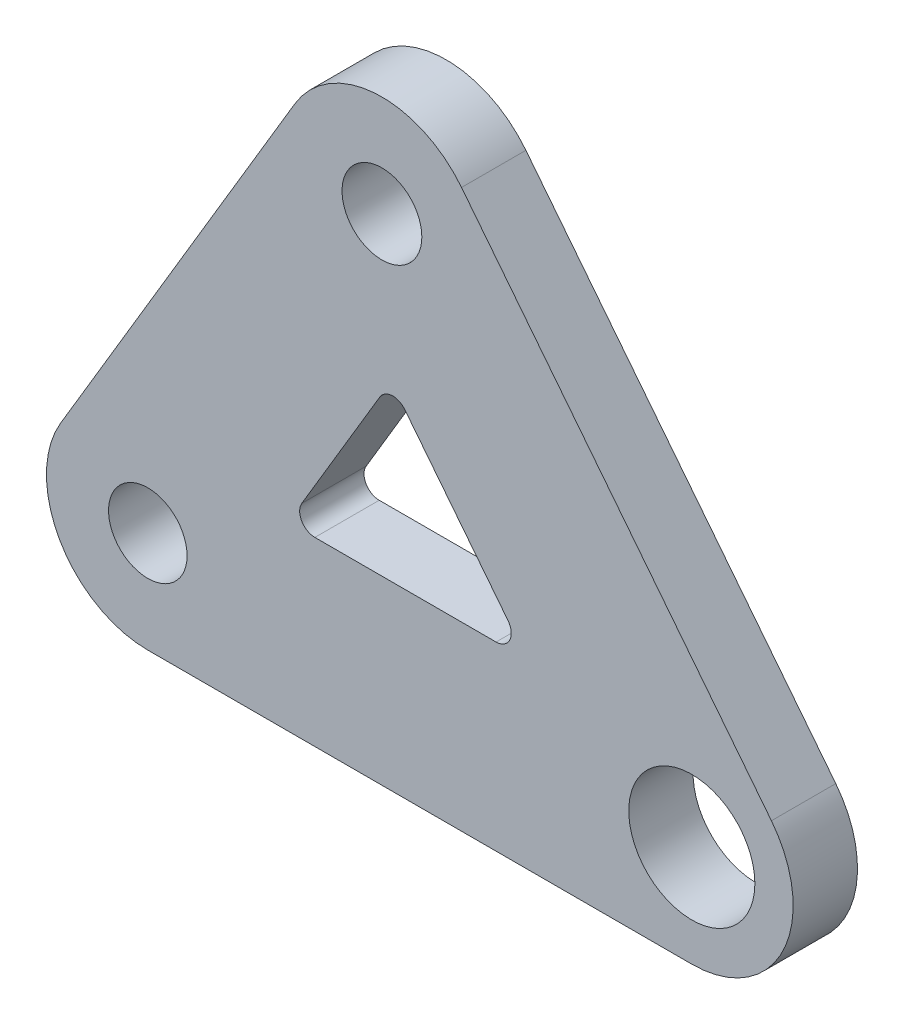
ISO-10303-21;
HEADER;
FILE_DESCRIPTION(('STEP AP214'),'2;1');
FILE_NAME('part.step','',(''),(''),'','','');
FILE_SCHEMA(('AUTOMOTIVE_DESIGN { 1 0 10303 214 1 1 1 1 }'));
ENDSEC;
DATA;
#1=APPLICATION_CONTEXT('core data for automotive mechanical design processes');
#2=APPLICATION_PROTOCOL_DEFINITION('international standard','automotive_design',2000,#1);
#3=PRODUCT_CONTEXT('',#1,'mechanical');
#4=PRODUCT('Part','Part','',(#3));
#5=PRODUCT_RELATED_PRODUCT_CATEGORY('part','',(#4));
#6=PRODUCT_DEFINITION_FORMATION('','',#4);
#7=PRODUCT_DEFINITION_CONTEXT('part definition',#1,'design');
#8=PRODUCT_DEFINITION('design','',#6,#7);
#9=PRODUCT_DEFINITION_SHAPE('','',#8);
#10=(LENGTH_UNIT() NAMED_UNIT(*) SI_UNIT(.MILLI.,.METRE.));
#11=(NAMED_UNIT(*) PLANE_ANGLE_UNIT() SI_UNIT($,.RADIAN.));
#12=(NAMED_UNIT(*) SI_UNIT($,.STERADIAN.) SOLID_ANGLE_UNIT());
#13=UNCERTAINTY_MEASURE_WITH_UNIT(LENGTH_MEASURE(1.E-05),#10,'distance_accuracy_value','');
#14=(GEOMETRIC_REPRESENTATION_CONTEXT(3) GLOBAL_UNCERTAINTY_ASSIGNED_CONTEXT((#13)) GLOBAL_UNIT_ASSIGNED_CONTEXT((#10,
#11,#12)) REPRESENTATION_CONTEXT('',''));
#15=CARTESIAN_POINT('',(0.,0.,0.));
#16=DIRECTION('',(0.,0.,1.));
#17=DIRECTION('',(1.,0.,0.));
#18=AXIS2_PLACEMENT_3D('',#15,#16,#17);
#19=CARTESIAN_POINT('',(-6.18682031703361,-4.8722560857102,6.35));
#20=DIRECTION('',(-0.785627976766173,-0.618699185487009,0.));
#21=DIRECTION('',(0.61869918548701,-0.785627976766173,0.));
#22=AXIS2_PLACEMENT_3D('',#19,#20,#21);
#23=PLANE('',#22);
#24=DIRECTION('',(-0.61869918548701,0.785627976766173,0.));
#25=VECTOR('',#24,1.);
#26=CARTESIAN_POINT('',(-6.18682031703361,-4.8722560857102,6.35));
#27=LINE('',#26,#25);
#28=CARTESIAN_POINT('',(12.4422084163789,-28.5275097150316,6.35));
#29=VERTEX_POINT('',#28);
#30=CARTESIAN_POINT('',(2.25684342657164,-15.5940714993847,6.35));
#31=VERTEX_POINT('',#30);
#32=EDGE_CURVE('E195',#29,#31,#27,.T.);
#33=ORIENTED_EDGE('',*,*,#32,.T.);
#34=DIRECTION('',(0.,0.,-1.));
#35=VECTOR('',#34,1.);
#36=CARTESIAN_POINT('',(2.25684342657164,-15.5940714993847,0.));
#37=LINE('',#36,#35);
#38=CARTESIAN_POINT('',(2.25684342657164,-15.5940714993847,0.));
#39=VERTEX_POINT('',#38);
#40=EDGE_CURVE('E271',#31,#39,#37,.T.);
#41=ORIENTED_EDGE('',*,*,#40,.T.);
#42=DIRECTION('',(-0.61869918548701,0.785627976766173,0.));
#43=VECTOR('',#42,1.);
#44=CARTESIAN_POINT('',(-6.18682031703361,-4.8722560857102,0.));
#45=LINE('',#44,#43);
#46=CARTESIAN_POINT('',(12.4422084163789,-28.5275097150316,0.));
#47=VERTEX_POINT('',#46);
#48=EDGE_CURVE('E238',#47,#39,#45,.T.);
#49=ORIENTED_EDGE('',*,*,#48,.F.);
#50=DIRECTION('',(0.,0.,-1.));
#51=VECTOR('',#50,1.);
#52=CARTESIAN_POINT('',(12.4422084163789,-28.5275097150316,6.35));
#53=LINE('',#52,#51);
#54=EDGE_CURVE('E158',#47,#29,#53,.F.);
#55=ORIENTED_EDGE('',*,*,#54,.T.);
#56=EDGE_LOOP('',(#33,#41,#49,#55));
#57=FACE_BOUND('',#56,.T.);
#58=ADVANCED_FACE('F54',(#57),#23,.T.);
#59=CARTESIAN_POINT('',(0.,-30.9555584932621,6.35));
#60=DIRECTION('',(0.,1.,0.));
#61=DIRECTION('',(0.,0.,1.));
#62=AXIS2_PLACEMENT_3D('',#59,#60,#61);
#63=PLANE('',#62);
#64=DIRECTION('',(1.,0.,0.));
#65=VECTOR('',#64,1.);
#66=CARTESIAN_POINT('',(0.,-30.9555584932621,6.35));
#67=LINE('',#66,#65);
#68=CARTESIAN_POINT('',(-6.61691580397189,-30.9555584932621,6.35));
#69=VERTEX_POINT('',#68);
#70=CARTESIAN_POINT('',(11.2637664512296,-30.9555584932621,6.35));
#71=VERTEX_POINT('',#70);
#72=EDGE_CURVE('E200',#69,#71,#67,.T.);
#73=ORIENTED_EDGE('',*,*,#72,.T.);
#74=DIRECTION('',(0.,0.,-1.));
#75=VECTOR('',#74,1.);
#76=CARTESIAN_POINT('',(11.2637664512296,-30.9555584932621,0.));
#77=LINE('',#76,#75);
#78=CARTESIAN_POINT('',(11.2637664512296,-30.9555584932621,0.));
#79=VERTEX_POINT('',#78);
#80=EDGE_CURVE('E288',#71,#79,#77,.T.);
#81=ORIENTED_EDGE('',*,*,#80,.T.);
#82=DIRECTION('',(1.,0.,0.));
#83=VECTOR('',#82,1.);
#84=CARTESIAN_POINT('',(0.,-30.9555584932621,0.));
#85=LINE('',#84,#83);
#86=CARTESIAN_POINT('',(-6.61691580397189,-30.9555584932621,0.));
#87=VERTEX_POINT('',#86);
#88=EDGE_CURVE('E245',#87,#79,#85,.T.);
#89=ORIENTED_EDGE('',*,*,#88,.F.);
#90=DIRECTION('',(0.,0.,-1.));
#91=VECTOR('',#90,1.);
#92=CARTESIAN_POINT('',(-6.61691580397189,-30.9555584932621,6.35));
#93=LINE('',#92,#91);
#94=EDGE_CURVE('E76',#87,#69,#93,.F.);
#95=ORIENTED_EDGE('',*,*,#94,.T.);
#96=EDGE_LOOP('',(#73,#81,#89,#95));
#97=FACE_BOUND('',#96,.T.);
#98=ADVANCED_FACE('F307',(#97),#63,.T.);
#99=CARTESIAN_POINT('',(-8.59385093655867,5.11328916454076,6.35));
#100=DIRECTION('',(-0.859385093655866,0.511328916454075,0.));
#101=DIRECTION('',(-0.511328916454075,-0.859385093655866,0.));
#102=AXIS2_PLACEMENT_3D('',#99,#100,#101);
#103=PLANE('',#102);
#104=DIRECTION('',(0.511328916454075,0.859385093655866,0.));
#105=VECTOR('',#104,1.);
#106=CARTESIAN_POINT('',(-8.59385093655867,5.11328916454076,0.));
#107=LINE('',#106,#105);
#108=CARTESIAN_POINT('',(-31.6977976377999,-33.7172693287214,0.));
#109=VERTEX_POINT('',#108);
#110=CARTESIAN_POINT('',(-8.59385093655866,5.11328916454076,0.));
#111=VERTEX_POINT('',#110);
#112=EDGE_CURVE('E154',#109,#111,#107,.T.);
#113=ORIENTED_EDGE('',*,*,#112,.F.);
#114=DIRECTION('',(0.,0.,-1.));
#115=VECTOR('',#114,1.);
#116=CARTESIAN_POINT('',(-31.6977976377999,-33.7172693287214,6.35));
#117=LINE('',#116,#115);
#118=CARTESIAN_POINT('',(-31.6977976377999,-33.7172693287214,6.35));
#119=VERTEX_POINT('',#118);
#120=EDGE_CURVE('E148',#119,#109,#117,.T.);
#121=ORIENTED_EDGE('',*,*,#120,.F.);
#122=DIRECTION('',(0.511328916454075,0.859385093655866,0.));
#123=VECTOR('',#122,1.);
#124=CARTESIAN_POINT('',(-8.59385093655867,5.11328916454076,6.35));
#125=LINE('',#124,#123);
#126=CARTESIAN_POINT('',(-8.59385093655866,5.11328916454076,6.35));
#127=VERTEX_POINT('',#126);
#128=EDGE_CURVE('E146',#119,#127,#125,.T.);
#129=ORIENTED_EDGE('',*,*,#128,.T.);
#130=DIRECTION('',(0.,0.,-1.));
#131=VECTOR('',#130,1.);
#132=CARTESIAN_POINT('',(-8.59385093655866,5.11328916454076,6.35));
#133=LINE('',#132,#131);
#134=EDGE_CURVE('E219',#127,#111,#133,.T.);
#135=ORIENTED_EDGE('',*,*,#134,.T.);
#136=EDGE_LOOP('',(#113,#121,#129,#135));
#137=FACE_BOUND('',#136,.T.);
#138=ADVANCED_FACE('F147',(#137),#103,.T.);
#139=CARTESIAN_POINT('',(-23.1039467012412,-38.8305584932621,6.35));
#140=DIRECTION('',(0.,0.,-1.));
#141=DIRECTION('',(-1.,0.,0.));
#142=AXIS2_PLACEMENT_3D('',#139,#140,#141);
#143=CYLINDRICAL_SURFACE('',#142,10.);
#144=CARTESIAN_POINT('',(-23.1039467012412,-38.8305584932621,0.));
#145=DIRECTION('',(0.,0.,1.));
#146=DIRECTION('',(1.,0.,0.));
#147=AXIS2_PLACEMENT_3D('',#144,#145,#146);
#148=CIRCLE('',#147,10.);
#149=CARTESIAN_POINT('',(-23.1039467012412,-48.8305584932621,0.));
#150=VERTEX_POINT('',#149);
#151=EDGE_CURVE('E218',#109,#150,#148,.T.);
#152=ORIENTED_EDGE('',*,*,#151,.T.);
#153=DIRECTION('',(0.,0.,-1.));
#154=VECTOR('',#153,1.);
#155=CARTESIAN_POINT('',(-23.1039467012412,-48.8305584932621,6.35));
#156=LINE('',#155,#154);
#157=CARTESIAN_POINT('',(-23.1039467012412,-48.8305584932621,6.35));
#158=VERTEX_POINT('',#157);
#159=EDGE_CURVE('E159',#158,#150,#156,.T.);
#160=ORIENTED_EDGE('',*,*,#159,.F.);
#161=CARTESIAN_POINT('',(-23.1039467012412,-38.8305584932621,6.35));
#162=DIRECTION('',(0.,0.,1.));
#163=DIRECTION('',(1.,0.,0.));
#164=AXIS2_PLACEMENT_3D('',#161,#162,#163);
#165=CIRCLE('',#164,10.);
#166=EDGE_CURVE('E156',#119,#158,#165,.T.);
#167=ORIENTED_EDGE('',*,*,#166,.F.);
#168=ORIENTED_EDGE('',*,*,#120,.T.);
#169=EDGE_LOOP('',(#152,#160,#167,#168));
#170=FACE_BOUND('',#169,.T.);
#171=ADVANCED_FACE('F163',(#170),#143,.T.);
#172=CARTESIAN_POINT('',(0.,-48.8305584932621,6.35));
#173=DIRECTION('',(0.,1.,0.));
#174=DIRECTION('',(0.,0.,1.));
#175=AXIS2_PLACEMENT_3D('',#172,#173,#174);
#176=PLANE('',#175);
#177=DIRECTION('',(1.,0.,0.));
#178=VECTOR('',#177,1.);
#179=CARTESIAN_POINT('',(0.,-48.8305584932621,0.));
#180=LINE('',#179,#178);
#181=CARTESIAN_POINT('',(30.5799126587588,-48.8305584932621,0.));
#182=VERTEX_POINT('',#181);
#183=EDGE_CURVE('E222',#150,#182,#180,.T.);
#184=ORIENTED_EDGE('',*,*,#183,.T.);
#185=DIRECTION('',(0.,0.,-1.));
#186=VECTOR('',#185,1.);
#187=CARTESIAN_POINT('',(30.5799126587588,-48.8305584932621,6.35));
#188=LINE('',#187,#186);
#189=CARTESIAN_POINT('',(30.5799126587588,-48.8305584932621,6.35));
#190=VERTEX_POINT('',#189);
#191=EDGE_CURVE('E263',#190,#182,#188,.T.);
#192=ORIENTED_EDGE('',*,*,#191,.F.);
#193=DIRECTION('',(1.,0.,0.));
#194=VECTOR('',#193,1.);
#195=CARTESIAN_POINT('',(0.,-48.8305584932621,6.35));
#196=LINE('',#195,#194);
#197=EDGE_CURVE('E168',#158,#190,#196,.T.);
#198=ORIENTED_EDGE('',*,*,#197,.F.);
#199=ORIENTED_EDGE('',*,*,#159,.T.);
#200=EDGE_LOOP('',(#184,#192,#198,#199));
#201=FACE_BOUND('',#200,.T.);
#202=ADVANCED_FACE('F355',(#201),#176,.F.);
#203=CARTESIAN_POINT('',(30.5799126587588,-38.8305584932621,6.35));
#204=DIRECTION('',(0.,0.,-1.));
#205=DIRECTION('',(-1.,0.,0.));
#206=AXIS2_PLACEMENT_3D('',#203,#204,#205);
#207=CYLINDRICAL_SURFACE('',#206,10.);
#208=CARTESIAN_POINT('',(30.5799126587588,-38.8305584932621,0.));
#209=DIRECTION('',(0.,0.,1.));
#210=DIRECTION('',(1.,0.,0.));
#211=AXIS2_PLACEMENT_3D('',#208,#209,#210);
#212=CIRCLE('',#211,10.);
#213=CARTESIAN_POINT('',(38.4361924264205,-32.643566638392,0.));
#214=VERTEX_POINT('',#213);
#215=EDGE_CURVE('E228',#182,#214,#212,.T.);
#216=ORIENTED_EDGE('',*,*,#215,.T.);
#217=DIRECTION('',(0.,0.,-1.));
#218=VECTOR('',#217,1.);
#219=CARTESIAN_POINT('',(38.4361924264205,-32.643566638392,6.35));
#220=LINE('',#219,#218);
#221=CARTESIAN_POINT('',(38.4361924264205,-32.643566638392,6.35));
#222=VERTEX_POINT('',#221);
#223=EDGE_CURVE('E264',#222,#214,#220,.T.);
#224=ORIENTED_EDGE('',*,*,#223,.F.);
#225=CARTESIAN_POINT('',(30.5799126587588,-38.8305584932621,6.35));
#226=DIRECTION('',(0.,0.,1.));
#227=DIRECTION('',(1.,0.,0.));
#228=AXIS2_PLACEMENT_3D('',#225,#226,#227);
#229=CIRCLE('',#228,10.);
#230=EDGE_CURVE('E184',#190,#222,#229,.T.);
#231=ORIENTED_EDGE('',*,*,#230,.F.);
#232=ORIENTED_EDGE('',*,*,#191,.T.);
#233=EDGE_LOOP('',(#216,#224,#231,#232));
#234=FACE_BOUND('',#233,.T.);
#235=ADVANCED_FACE('F348',(#234),#207,.T.);
#236=CARTESIAN_POINT('',(7.85627976766173,6.1869918548701,6.35));
#237=DIRECTION('',(0.785627976766173,0.61869918548701,0.));
#238=DIRECTION('',(-0.61869918548701,0.785627976766173,0.));
#239=AXIS2_PLACEMENT_3D('',#236,#237,#238);
#240=PLANE('',#239);
#241=DIRECTION('',(0.61869918548701,-0.785627976766173,0.));
#242=VECTOR('',#241,1.);
#243=CARTESIAN_POINT('',(7.85627976766173,6.1869918548701,0.));
#244=LINE('',#243,#242);
#245=CARTESIAN_POINT('',(7.85627976766173,6.1869918548701,0.));
#246=VERTEX_POINT('',#245);
#247=EDGE_CURVE('E229',#246,#214,#244,.T.);
#248=ORIENTED_EDGE('',*,*,#247,.F.);
#249=DIRECTION('',(0.,0.,-1.));
#250=VECTOR('',#249,1.);
#251=CARTESIAN_POINT('',(7.85627976766173,6.1869918548701,6.35));
#252=LINE('',#251,#250);
#253=CARTESIAN_POINT('',(7.85627976766173,6.1869918548701,6.35));
#254=VERTEX_POINT('',#253);
#255=EDGE_CURVE('E260',#254,#246,#252,.T.);
#256=ORIENTED_EDGE('',*,*,#255,.F.);
#257=DIRECTION('',(0.61869918548701,-0.785627976766173,0.));
#258=VECTOR('',#257,1.);
#259=CARTESIAN_POINT('',(7.85627976766173,6.1869918548701,6.35));
#260=LINE('',#259,#258);
#261=EDGE_CURVE('E189',#254,#222,#260,.T.);
#262=ORIENTED_EDGE('',*,*,#261,.T.);
#263=ORIENTED_EDGE('',*,*,#223,.T.);
#264=EDGE_LOOP('',(#248,#256,#262,#263));
#265=FACE_BOUND('',#264,.T.);
#266=ADVANCED_FACE('F347',(#265),#240,.T.);
#267=CARTESIAN_POINT('',(30.5799126587588,-38.8305584932621,6.35));
#268=DIRECTION('',(0.,0.,-1.));
#269=DIRECTION('',(-1.,0.,0.));
#270=AXIS2_PLACEMENT_3D('',#267,#268,#269);
#271=CYLINDRICAL_SURFACE('',#270,6.223);
#272=CARTESIAN_POINT('',(30.5799126587588,-38.8305584932621,6.35));
#273=DIRECTION('',(0.,0.,1.));
#274=DIRECTION('',(1.,0.,0.));
#275=AXIS2_PLACEMENT_3D('',#272,#273,#274);
#276=CIRCLE('',#275,6.223);
#277=CARTESIAN_POINT('',(36.8029126587588,-38.8305584932621,6.35));
#278=VERTEX_POINT('',#277);
#279=EDGE_CURVE('E209',#278,#278,#276,.T.);
#280=ORIENTED_EDGE('',*,*,#279,.T.);
#281=EDGE_LOOP('',(#280));
#282=FACE_BOUND('',#281,.T.);
#283=CARTESIAN_POINT('',(30.5799126587588,-38.8305584932621,0.));
#284=DIRECTION('',(0.,0.,1.));
#285=DIRECTION('',(1.,0.,0.));
#286=AXIS2_PLACEMENT_3D('',#283,#284,#285);
#287=CIRCLE('',#286,6.223);
#288=CARTESIAN_POINT('',(36.8029126587588,-38.8305584932621,0.));
#289=VERTEX_POINT('',#288);
#290=EDGE_CURVE('E179',#289,#289,#287,.T.);
#291=ORIENTED_EDGE('',*,*,#290,.F.);
#292=EDGE_LOOP('',(#291));
#293=FACE_BOUND('',#292,.T.);
#294=ADVANCED_FACE('F346',(#282,#293),#271,.F.);
#295=CARTESIAN_POINT('',(0.,0.,6.35));
#296=DIRECTION('',(0.,0.,-1.));
#297=DIRECTION('',(-1.,0.,0.));
#298=AXIS2_PLACEMENT_3D('',#295,#296,#297);
#299=CYLINDRICAL_SURFACE('',#298,3.9375);
#300=CARTESIAN_POINT('',(0.,0.,6.35));
#301=DIRECTION('',(0.,0.,1.));
#302=DIRECTION('',(1.,0.,0.));
#303=AXIS2_PLACEMENT_3D('',#300,#301,#302);
#304=CIRCLE('',#303,3.9375);
#305=CARTESIAN_POINT('',(3.9375,0.,6.35));
#306=VERTEX_POINT('',#305);
#307=EDGE_CURVE('E201',#306,#306,#304,.T.);
#308=ORIENTED_EDGE('',*,*,#307,.T.);
#309=EDGE_LOOP('',(#308));
#310=FACE_BOUND('',#309,.T.);
#311=CARTESIAN_POINT('',(0.,0.,0.));
#312=DIRECTION('',(0.,0.,1.));
#313=DIRECTION('',(1.,0.,0.));
#314=AXIS2_PLACEMENT_3D('',#311,#312,#313);
#315=CIRCLE('',#314,3.9375);
#316=CARTESIAN_POINT('',(3.9375,0.,0.));
#317=VERTEX_POINT('',#316);
#318=EDGE_CURVE('E249',#317,#317,#315,.T.);
#319=ORIENTED_EDGE('',*,*,#318,.F.);
#320=EDGE_LOOP('',(#319));
#321=FACE_BOUND('',#320,.T.);
#322=ADVANCED_FACE('F390',(#310,#321),#299,.F.);
#323=CARTESIAN_POINT('',(6.76765761253994,-4.02671521707585,6.35));
#324=DIRECTION('',(0.859385093655866,-0.511328916454076,0.));
#325=DIRECTION('',(0.511328916454076,0.859385093655866,0.));
#326=AXIS2_PLACEMENT_3D('',#323,#324,#325);
#327=PLANE('',#326);
#328=DIRECTION('',(-0.511328916454076,-0.859385093655866,0.));
#329=VECTOR('',#328,1.);
#330=CARTESIAN_POINT('',(6.76765761253994,-4.02671521707585,0.));
#331=LINE('',#330,#329);
#332=CARTESIAN_POINT('',(-0.21067617906142,-15.7551269029341,0.));
#333=VERTEX_POINT('',#332);
#334=CARTESIAN_POINT('',(-7.9059934444557,-28.688565118581,0.));
#335=VERTEX_POINT('',#334);
#336=EDGE_CURVE('E246',#333,#335,#331,.T.);
#337=ORIENTED_EDGE('',*,*,#336,.F.);
#338=DIRECTION('',(0.,0.,-1.));
#339=VECTOR('',#338,1.);
#340=CARTESIAN_POINT('',(-0.210676179061417,-15.7551269029341,6.35));
#341=LINE('',#340,#339);
#342=CARTESIAN_POINT('',(-0.21067617906142,-15.7551269029341,6.35));
#343=VERTEX_POINT('',#342);
#344=EDGE_CURVE('E282',#333,#343,#341,.F.);
#345=ORIENTED_EDGE('',*,*,#344,.T.);
#346=DIRECTION('',(-0.511328916454076,-0.859385093655866,0.));
#347=VECTOR('',#346,1.);
#348=CARTESIAN_POINT('',(6.76765761253994,-4.02671521707585,6.35));
#349=LINE('',#348,#347);
#350=CARTESIAN_POINT('',(-7.9059934444557,-28.688565118581,6.35));
#351=VERTEX_POINT('',#350);
#352=EDGE_CURVE('E203',#343,#351,#349,.T.);
#353=ORIENTED_EDGE('',*,*,#352,.T.);
#354=DIRECTION('',(0.,0.,-1.));
#355=VECTOR('',#354,1.);
#356=CARTESIAN_POINT('',(-7.90599344445569,-28.688565118581,0.));
#357=LINE('',#356,#355);
#358=EDGE_CURVE('E279',#351,#335,#357,.T.);
#359=ORIENTED_EDGE('',*,*,#358,.T.);
#360=EDGE_LOOP('',(#337,#345,#353,#359));
#361=FACE_BOUND('',#360,.T.);
#362=ADVANCED_FACE('F317',(#361),#327,.T.);
#363=CARTESIAN_POINT('',(0.,0.,6.35));
#364=DIRECTION('',(0.,0.,-1.));
#365=DIRECTION('',(-1.,0.,0.));
#366=AXIS2_PLACEMENT_3D('',#363,#364,#365);
#367=CYLINDRICAL_SURFACE('',#366,10.);
#368=CARTESIAN_POINT('',(0.,0.,0.));
#369=DIRECTION('',(0.,0.,1.));
#370=DIRECTION('',(1.,0.,0.));
#371=AXIS2_PLACEMENT_3D('',#368,#369,#370);
#372=CIRCLE('',#371,10.);
#373=EDGE_CURVE('E234',#246,#111,#372,.T.);
#374=ORIENTED_EDGE('',*,*,#373,.T.);
#375=ORIENTED_EDGE('',*,*,#134,.F.);
#376=CARTESIAN_POINT('',(0.,0.,6.35));
#377=DIRECTION('',(0.,0.,1.));
#378=DIRECTION('',(1.,0.,0.));
#379=AXIS2_PLACEMENT_3D('',#376,#377,#378);
#380=CIRCLE('',#379,10.);
#381=EDGE_CURVE('E171',#254,#127,#380,.T.);
#382=ORIENTED_EDGE('',*,*,#381,.F.);
#383=ORIENTED_EDGE('',*,*,#255,.T.);
#384=EDGE_LOOP('',(#374,#375,#382,#383));
#385=FACE_BOUND('',#384,.T.);
#386=ADVANCED_FACE('F343',(#385),#367,.T.);
#387=CARTESIAN_POINT('',(-23.1039467012412,-38.8305584932621,6.35));
#388=DIRECTION('',(0.,0.,-1.));
#389=DIRECTION('',(-1.,0.,0.));
#390=AXIS2_PLACEMENT_3D('',#387,#388,#389);
#391=CYLINDRICAL_SURFACE('',#390,3.875);
#392=CARTESIAN_POINT('',(-23.1039467012412,-38.8305584932621,6.35));
#393=DIRECTION('',(0.,0.,1.));
#394=DIRECTION('',(1.,0.,0.));
#395=AXIS2_PLACEMENT_3D('',#392,#393,#394);
#396=CIRCLE('',#395,3.875);
#397=CARTESIAN_POINT('',(-19.2289467012412,-38.8305584932621,6.35));
#398=VERTEX_POINT('',#397);
#399=EDGE_CURVE('E212',#398,#398,#396,.T.);
#400=ORIENTED_EDGE('',*,*,#399,.T.);
#401=EDGE_LOOP('',(#400));
#402=FACE_BOUND('',#401,.T.);
#403=CARTESIAN_POINT('',(-23.1039467012412,-38.8305584932621,0.));
#404=DIRECTION('',(0.,0.,1.));
#405=DIRECTION('',(1.,0.,0.));
#406=AXIS2_PLACEMENT_3D('',#403,#404,#405);
#407=CIRCLE('',#406,3.875);
#408=CARTESIAN_POINT('',(-19.2289467012412,-38.8305584932621,0.));
#409=VERTEX_POINT('',#408);
#410=EDGE_CURVE('E172',#409,#409,#407,.T.);
#411=ORIENTED_EDGE('',*,*,#410,.F.);
#412=EDGE_LOOP('',(#411));
#413=FACE_BOUND('',#412,.T.);
#414=ADVANCED_FACE('F345',(#402,#413),#391,.F.);
#415=CARTESIAN_POINT('',(0.,0.,6.35));
#416=DIRECTION('',(0.,0.,1.));
#417=DIRECTION('',(1.,0.,0.));
#418=AXIS2_PLACEMENT_3D('',#415,#416,#417);
#419=PLANE('',#418);
#420=ORIENTED_EDGE('',*,*,#128,.F.);
#421=ORIENTED_EDGE('',*,*,#166,.T.);
#422=ORIENTED_EDGE('',*,*,#197,.T.);
#423=ORIENTED_EDGE('',*,*,#230,.T.);
#424=ORIENTED_EDGE('',*,*,#261,.F.);
#425=ORIENTED_EDGE('',*,*,#381,.T.);
#426=EDGE_LOOP('',(#420,#421,#422,#423,#424,#425));
#427=FACE_BOUND('',#426,.T.);
#428=ORIENTED_EDGE('',*,*,#32,.F.);
#429=CARTESIAN_POINT('',(11.2637664512296,-29.4555584932621,6.35));
#430=DIRECTION('',(0.,0.,1.));
#431=DIRECTION('',(1.,0.,0.));
#432=AXIS2_PLACEMENT_3D('',#429,#430,#431);
#433=CIRCLE('',#432,1.5);
#434=EDGE_CURVE('E73',#29,#71,#433,.F.);
#435=ORIENTED_EDGE('',*,*,#434,.T.);
#436=ORIENTED_EDGE('',*,*,#72,.F.);
#437=CARTESIAN_POINT('',(-6.61691580397189,-29.4555584932621,6.35));
#438=DIRECTION('',(0.,0.,1.));
#439=DIRECTION('',(1.,0.,0.));
#440=AXIS2_PLACEMENT_3D('',#437,#438,#439);
#441=CIRCLE('',#440,1.5);
#442=EDGE_CURVE('E11',#69,#351,#441,.F.);
#443=ORIENTED_EDGE('',*,*,#442,.T.);
#444=ORIENTED_EDGE('',*,*,#352,.F.);
#445=CARTESIAN_POINT('',(1.07840146142238,-16.5221202776152,6.35));
#446=DIRECTION('',(0.,0.,1.));
#447=DIRECTION('',(1.,0.,0.));
#448=AXIS2_PLACEMENT_3D('',#445,#446,#447);
#449=CIRCLE('',#448,1.5);
#450=EDGE_CURVE('E291',#343,#31,#449,.F.);
#451=ORIENTED_EDGE('',*,*,#450,.T.);
#452=EDGE_LOOP('',(#428,#435,#436,#443,#444,#451));
#453=FACE_BOUND('',#452,.T.);
#454=ORIENTED_EDGE('',*,*,#307,.F.);
#455=EDGE_LOOP('',(#454));
#456=FACE_BOUND('',#455,.T.);
#457=ORIENTED_EDGE('',*,*,#279,.F.);
#458=EDGE_LOOP('',(#457));
#459=FACE_BOUND('',#458,.T.);
#460=ORIENTED_EDGE('',*,*,#399,.F.);
#461=EDGE_LOOP('',(#460));
#462=FACE_BOUND('',#461,.T.);
#463=ADVANCED_FACE('F166',(#427,#453,#456,#459,#462),#419,.T.);
#464=CARTESIAN_POINT('',(0.,0.,0.));
#465=DIRECTION('',(0.,0.,1.));
#466=DIRECTION('',(1.,0.,0.));
#467=AXIS2_PLACEMENT_3D('',#464,#465,#466);
#468=PLANE('',#467);
#469=ORIENTED_EDGE('',*,*,#112,.T.);
#470=ORIENTED_EDGE('',*,*,#373,.F.);
#471=ORIENTED_EDGE('',*,*,#247,.T.);
#472=ORIENTED_EDGE('',*,*,#215,.F.);
#473=ORIENTED_EDGE('',*,*,#183,.F.);
#474=ORIENTED_EDGE('',*,*,#151,.F.);
#475=EDGE_LOOP('',(#469,#470,#471,#472,#473,#474));
#476=FACE_BOUND('',#475,.T.);
#477=ORIENTED_EDGE('',*,*,#88,.T.);
#478=CARTESIAN_POINT('',(11.2637664512296,-29.4555584932621,0.));
#479=DIRECTION('',(0.,0.,1.));
#480=DIRECTION('',(1.,0.,0.));
#481=AXIS2_PLACEMENT_3D('',#478,#479,#480);
#482=CIRCLE('',#481,1.5);
#483=EDGE_CURVE('E298',#79,#47,#482,.T.);
#484=ORIENTED_EDGE('',*,*,#483,.T.);
#485=ORIENTED_EDGE('',*,*,#48,.T.);
#486=CARTESIAN_POINT('',(1.07840146142238,-16.5221202776152,0.));
#487=DIRECTION('',(0.,0.,1.));
#488=DIRECTION('',(1.,0.,0.));
#489=AXIS2_PLACEMENT_3D('',#486,#487,#488);
#490=CIRCLE('',#489,1.5);
#491=EDGE_CURVE('E286',#39,#333,#490,.T.);
#492=ORIENTED_EDGE('',*,*,#491,.T.);
#493=ORIENTED_EDGE('',*,*,#336,.T.);
#494=CARTESIAN_POINT('',(-6.61691580397189,-29.4555584932621,0.));
#495=DIRECTION('',(0.,0.,1.));
#496=DIRECTION('',(1.,0.,0.));
#497=AXIS2_PLACEMENT_3D('',#494,#495,#496);
#498=CIRCLE('',#497,1.5);
#499=EDGE_CURVE('E65',#335,#87,#498,.T.);
#500=ORIENTED_EDGE('',*,*,#499,.T.);
#501=EDGE_LOOP('',(#477,#484,#485,#492,#493,#500));
#502=FACE_BOUND('',#501,.T.);
#503=ORIENTED_EDGE('',*,*,#318,.T.);
#504=EDGE_LOOP('',(#503));
#505=FACE_BOUND('',#504,.T.);
#506=ORIENTED_EDGE('',*,*,#290,.T.);
#507=EDGE_LOOP('',(#506));
#508=FACE_BOUND('',#507,.T.);
#509=ORIENTED_EDGE('',*,*,#410,.T.);
#510=EDGE_LOOP('',(#509));
#511=FACE_BOUND('',#510,.T.);
#512=ADVANCED_FACE('F302',(#476,#502,#505,#508,#511),#468,.F.);
#513=CARTESIAN_POINT('',(1.07840146142238,-16.5221202776152,6.35));
#514=DIRECTION('',(0.,0.,1.));
#515=DIRECTION('',(1.,0.,0.));
#516=AXIS2_PLACEMENT_3D('',#513,#514,#515);
#517=CYLINDRICAL_SURFACE('',#516,1.5);
#518=ORIENTED_EDGE('',*,*,#450,.F.);
#519=ORIENTED_EDGE('',*,*,#344,.F.);
#520=ORIENTED_EDGE('',*,*,#491,.F.);
#521=ORIENTED_EDGE('',*,*,#40,.F.);
#522=EDGE_LOOP('',(#518,#519,#520,#521));
#523=FACE_BOUND('',#522,.T.);
#524=ADVANCED_FACE('F316',(#523),#517,.F.);
#525=CARTESIAN_POINT('',(11.2637664512296,-29.4555584932621,6.35));
#526=DIRECTION('',(0.,0.,1.));
#527=DIRECTION('',(1.,0.,0.));
#528=AXIS2_PLACEMENT_3D('',#525,#526,#527);
#529=CYLINDRICAL_SURFACE('',#528,1.5);
#530=ORIENTED_EDGE('',*,*,#434,.F.);
#531=ORIENTED_EDGE('',*,*,#54,.F.);
#532=ORIENTED_EDGE('',*,*,#483,.F.);
#533=ORIENTED_EDGE('',*,*,#80,.F.);
#534=EDGE_LOOP('',(#530,#531,#532,#533));
#535=FACE_BOUND('',#534,.T.);
#536=ADVANCED_FACE('F321',(#535),#529,.F.);
#537=CARTESIAN_POINT('',(-6.61691580397189,-29.4555584932621,6.35));
#538=DIRECTION('',(0.,0.,1.));
#539=DIRECTION('',(1.,0.,0.));
#540=AXIS2_PLACEMENT_3D('',#537,#538,#539);
#541=CYLINDRICAL_SURFACE('',#540,1.5);
#542=ORIENTED_EDGE('',*,*,#442,.F.);
#543=ORIENTED_EDGE('',*,*,#94,.F.);
#544=ORIENTED_EDGE('',*,*,#499,.F.);
#545=ORIENTED_EDGE('',*,*,#358,.F.);
#546=EDGE_LOOP('',(#542,#543,#544,#545));
#547=FACE_BOUND('',#546,.T.);
#548=ADVANCED_FACE('F60',(#547),#541,.F.);
#549=CLOSED_SHELL('',(#58,#98,#138,#171,#202,#235,#266,#294,#322,#362,#386,#414,#463,#512,#524,
#536,#548));
#550=MANIFOLD_SOLID_BREP('B2',#549);
#551=ADVANCED_BREP_SHAPE_REPRESENTATION('',(#18,#550),#14);
#552=SHAPE_DEFINITION_REPRESENTATION(#9,#551);
ENDSEC;
END-ISO-10303-21;
